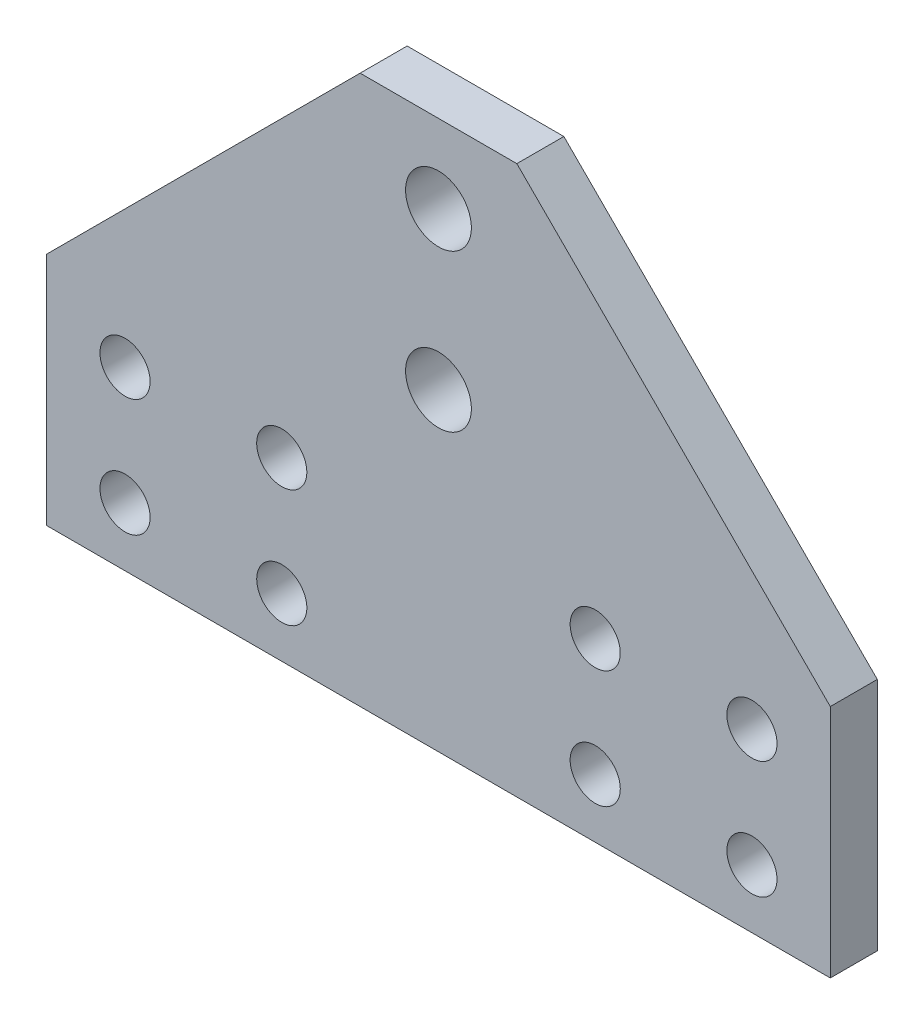
ISO-10303-21;
HEADER;
FILE_DESCRIPTION(('STEP AP214'),'2;1');
FILE_NAME('part.step','',(''),(''),'','','');
FILE_SCHEMA(('AUTOMOTIVE_DESIGN { 1 0 10303 214 1 1 1 1 }'));
ENDSEC;
DATA;
#1=APPLICATION_CONTEXT('core data for automotive mechanical design processes');
#2=APPLICATION_PROTOCOL_DEFINITION('international standard','automotive_design',2000,#1);
#3=PRODUCT_CONTEXT('',#1,'mechanical');
#4=PRODUCT('Part','Part','',(#3));
#5=PRODUCT_RELATED_PRODUCT_CATEGORY('part','',(#4));
#6=PRODUCT_DEFINITION_FORMATION('','',#4);
#7=PRODUCT_DEFINITION_CONTEXT('part definition',#1,'design');
#8=PRODUCT_DEFINITION('design','',#6,#7);
#9=PRODUCT_DEFINITION_SHAPE('','',#8);
#10=(LENGTH_UNIT() NAMED_UNIT(*) SI_UNIT(.MILLI.,.METRE.));
#11=(NAMED_UNIT(*) PLANE_ANGLE_UNIT() SI_UNIT($,.RADIAN.));
#12=(NAMED_UNIT(*) SI_UNIT($,.STERADIAN.) SOLID_ANGLE_UNIT());
#13=UNCERTAINTY_MEASURE_WITH_UNIT(LENGTH_MEASURE(1.E-05),#10,'distance_accuracy_value','');
#14=(GEOMETRIC_REPRESENTATION_CONTEXT(3) GLOBAL_UNCERTAINTY_ASSIGNED_CONTEXT((#13)) GLOBAL_UNIT_ASSIGNED_CONTEXT((#10,
#11,#12)) REPRESENTATION_CONTEXT('',''));
#15=CARTESIAN_POINT('',(0.,0.,0.));
#16=DIRECTION('',(0.,0.,1.));
#17=DIRECTION('',(1.,0.,0.));
#18=AXIS2_PLACEMENT_3D('',#15,#16,#17);
#19=CARTESIAN_POINT('',(-20.,-20.,3.));
#20=DIRECTION('',(0.707106781186548,-0.707106781186547,0.));
#21=DIRECTION('',(0.707106781186547,0.707106781186548,0.));
#22=AXIS2_PLACEMENT_3D('',#19,#20,#21);
#23=PLANE('',#22);
#24=DIRECTION('',(-0.707106781186547,-0.707106781186548,0.));
#25=VECTOR('',#24,1.);
#26=CARTESIAN_POINT('',(-20.,-20.,0.));
#27=LINE('',#26,#25);
#28=CARTESIAN_POINT('',(0.,0.,0.));
#29=VERTEX_POINT('',#28);
#30=CARTESIAN_POINT('',(-20.,-20.,0.));
#31=VERTEX_POINT('',#30);
#32=EDGE_CURVE('E132',#29,#31,#27,.T.);
#33=ORIENTED_EDGE('',*,*,#32,.T.);
#34=DIRECTION('',(0.,0.,-1.));
#35=VECTOR('',#34,1.);
#36=CARTESIAN_POINT('',(-20.,-20.,3.));
#37=LINE('',#36,#35);
#38=CARTESIAN_POINT('',(-20.,-20.,3.));
#39=VERTEX_POINT('',#38);
#40=EDGE_CURVE('E11',#39,#31,#37,.T.);
#41=ORIENTED_EDGE('',*,*,#40,.F.);
#42=DIRECTION('',(-0.707106781186547,-0.707106781186548,0.));
#43=VECTOR('',#42,1.);
#44=CARTESIAN_POINT('',(-20.,-20.,3.));
#45=LINE('',#44,#43);
#46=CARTESIAN_POINT('',(0.,0.,3.));
#47=VERTEX_POINT('',#46);
#48=EDGE_CURVE('E149',#47,#39,#45,.T.);
#49=ORIENTED_EDGE('',*,*,#48,.F.);
#50=DIRECTION('',(0.,0.,-1.));
#51=VECTOR('',#50,1.);
#52=CARTESIAN_POINT('',(0.,0.,3.));
#53=LINE('',#52,#51);
#54=EDGE_CURVE('E128',#47,#29,#53,.T.);
#55=ORIENTED_EDGE('',*,*,#54,.T.);
#56=EDGE_LOOP('',(#33,#41,#49,#55));
#57=FACE_BOUND('',#56,.T.);
#58=ADVANCED_FACE('F43',(#57),#23,.F.);
#59=CARTESIAN_POINT('',(-20.,-35.,3.));
#60=DIRECTION('',(1.,0.,0.));
#61=DIRECTION('',(0.,1.,0.));
#62=AXIS2_PLACEMENT_3D('',#59,#60,#61);
#63=PLANE('',#62);
#64=DIRECTION('',(0.,-1.,0.));
#65=VECTOR('',#64,1.);
#66=CARTESIAN_POINT('',(-20.,-35.,0.));
#67=LINE('',#66,#65);
#68=CARTESIAN_POINT('',(-20.,-35.,0.));
#69=VERTEX_POINT('',#68);
#70=EDGE_CURVE('E136',#31,#69,#67,.T.);
#71=ORIENTED_EDGE('',*,*,#70,.T.);
#72=DIRECTION('',(0.,0.,-1.));
#73=VECTOR('',#72,1.);
#74=CARTESIAN_POINT('',(-20.,-35.,3.));
#75=LINE('',#74,#73);
#76=CARTESIAN_POINT('',(-20.,-35.,3.));
#77=VERTEX_POINT('',#76);
#78=EDGE_CURVE('E52',#77,#69,#75,.T.);
#79=ORIENTED_EDGE('',*,*,#78,.F.);
#80=DIRECTION('',(0.,-1.,0.));
#81=VECTOR('',#80,1.);
#82=CARTESIAN_POINT('',(-20.,-35.,3.));
#83=LINE('',#82,#81);
#84=EDGE_CURVE('E97',#39,#77,#83,.T.);
#85=ORIENTED_EDGE('',*,*,#84,.F.);
#86=ORIENTED_EDGE('',*,*,#40,.T.);
#87=EDGE_LOOP('',(#71,#79,#85,#86));
#88=FACE_BOUND('',#87,.T.);
#89=ADVANCED_FACE('F178',(#88),#63,.F.);
#90=CARTESIAN_POINT('',(30.,-35.,3.));
#91=DIRECTION('',(0.,1.,0.));
#92=DIRECTION('',(-1.,0.,0.));
#93=AXIS2_PLACEMENT_3D('',#90,#91,#92);
#94=PLANE('',#93);
#95=DIRECTION('',(1.,0.,0.));
#96=VECTOR('',#95,1.);
#97=CARTESIAN_POINT('',(30.,-35.,0.));
#98=LINE('',#97,#96);
#99=CARTESIAN_POINT('',(30.,-35.,0.));
#100=VERTEX_POINT('',#99);
#101=EDGE_CURVE('E140',#69,#100,#98,.T.);
#102=ORIENTED_EDGE('',*,*,#101,.T.);
#103=DIRECTION('',(0.,0.,-1.));
#104=VECTOR('',#103,1.);
#105=CARTESIAN_POINT('',(30.,-35.,3.));
#106=LINE('',#105,#104);
#107=CARTESIAN_POINT('',(30.,-35.,3.));
#108=VERTEX_POINT('',#107);
#109=EDGE_CURVE('E121',#108,#100,#106,.T.);
#110=ORIENTED_EDGE('',*,*,#109,.F.);
#111=DIRECTION('',(1.,0.,0.));
#112=VECTOR('',#111,1.);
#113=CARTESIAN_POINT('',(30.,-35.,3.));
#114=LINE('',#113,#112);
#115=EDGE_CURVE('E110',#77,#108,#114,.T.);
#116=ORIENTED_EDGE('',*,*,#115,.F.);
#117=ORIENTED_EDGE('',*,*,#78,.T.);
#118=EDGE_LOOP('',(#102,#110,#116,#117));
#119=FACE_BOUND('',#118,.T.);
#120=ADVANCED_FACE('F159',(#119),#94,.F.);
#121=CARTESIAN_POINT('',(30.,-20.,3.));
#122=DIRECTION('',(-1.,0.,0.));
#123=DIRECTION('',(0.,-1.,0.));
#124=AXIS2_PLACEMENT_3D('',#121,#122,#123);
#125=PLANE('',#124);
#126=DIRECTION('',(0.,1.,0.));
#127=VECTOR('',#126,1.);
#128=CARTESIAN_POINT('',(30.,-20.,0.));
#129=LINE('',#128,#127);
#130=CARTESIAN_POINT('',(30.,-20.,0.));
#131=VERTEX_POINT('',#130);
#132=EDGE_CURVE('E119',#100,#131,#129,.T.);
#133=ORIENTED_EDGE('',*,*,#132,.T.);
#134=DIRECTION('',(0.,0.,-1.));
#135=VECTOR('',#134,1.);
#136=CARTESIAN_POINT('',(30.,-20.,3.));
#137=LINE('',#136,#135);
#138=CARTESIAN_POINT('',(30.,-20.,3.));
#139=VERTEX_POINT('',#138);
#140=EDGE_CURVE('E116',#139,#131,#137,.T.);
#141=ORIENTED_EDGE('',*,*,#140,.F.);
#142=DIRECTION('',(0.,1.,0.));
#143=VECTOR('',#142,1.);
#144=CARTESIAN_POINT('',(30.,-20.,3.));
#145=LINE('',#144,#143);
#146=EDGE_CURVE('E104',#108,#139,#145,.T.);
#147=ORIENTED_EDGE('',*,*,#146,.F.);
#148=ORIENTED_EDGE('',*,*,#109,.T.);
#149=EDGE_LOOP('',(#133,#141,#147,#148));
#150=FACE_BOUND('',#149,.T.);
#151=ADVANCED_FACE('F117',(#150),#125,.F.);
#152=CARTESIAN_POINT('',(10.,0.,3.));
#153=DIRECTION('',(-0.707106781186547,-0.707106781186548,0.));
#154=DIRECTION('',(0.707106781186548,-0.707106781186547,0.));
#155=AXIS2_PLACEMENT_3D('',#152,#153,#154);
#156=PLANE('',#155);
#157=DIRECTION('',(-0.707106781186548,0.707106781186547,0.));
#158=VECTOR('',#157,1.);
#159=CARTESIAN_POINT('',(10.,0.,0.));
#160=LINE('',#159,#158);
#161=CARTESIAN_POINT('',(10.,0.,0.));
#162=VERTEX_POINT('',#161);
#163=EDGE_CURVE('E83',#131,#162,#160,.T.);
#164=ORIENTED_EDGE('',*,*,#163,.T.);
#165=DIRECTION('',(0.,0.,-1.));
#166=VECTOR('',#165,1.);
#167=CARTESIAN_POINT('',(10.,0.,3.));
#168=LINE('',#167,#166);
#169=CARTESIAN_POINT('',(10.,0.,3.));
#170=VERTEX_POINT('',#169);
#171=EDGE_CURVE('E122',#170,#162,#168,.T.);
#172=ORIENTED_EDGE('',*,*,#171,.F.);
#173=DIRECTION('',(-0.707106781186548,0.707106781186547,0.));
#174=VECTOR('',#173,1.);
#175=CARTESIAN_POINT('',(10.,0.,3.));
#176=LINE('',#175,#174);
#177=EDGE_CURVE('E108',#139,#170,#176,.T.);
#178=ORIENTED_EDGE('',*,*,#177,.F.);
#179=ORIENTED_EDGE('',*,*,#140,.T.);
#180=EDGE_LOOP('',(#164,#172,#178,#179));
#181=FACE_BOUND('',#180,.T.);
#182=ADVANCED_FACE('F124',(#181),#156,.F.);
#183=CARTESIAN_POINT('',(0.,0.,3.));
#184=DIRECTION('',(0.,-1.,0.));
#185=DIRECTION('',(0.,0.,-1.));
#186=AXIS2_PLACEMENT_3D('',#183,#184,#185);
#187=PLANE('',#186);
#188=DIRECTION('',(-1.,0.,0.));
#189=VECTOR('',#188,1.);
#190=CARTESIAN_POINT('',(0.,0.,0.));
#191=LINE('',#190,#189);
#192=EDGE_CURVE('E89',#162,#29,#191,.T.);
#193=ORIENTED_EDGE('',*,*,#192,.T.);
#194=ORIENTED_EDGE('',*,*,#54,.F.);
#195=DIRECTION('',(-1.,0.,0.));
#196=VECTOR('',#195,1.);
#197=CARTESIAN_POINT('',(0.,0.,3.));
#198=LINE('',#197,#196);
#199=EDGE_CURVE('E60',#170,#47,#198,.T.);
#200=ORIENTED_EDGE('',*,*,#199,.F.);
#201=ORIENTED_EDGE('',*,*,#171,.T.);
#202=EDGE_LOOP('',(#193,#194,#200,#201));
#203=FACE_BOUND('',#202,.T.);
#204=ADVANCED_FACE('F166',(#203),#187,.F.);
#205=CARTESIAN_POINT('',(0.,0.,3.));
#206=DIRECTION('',(0.,0.,-1.));
#207=DIRECTION('',(-1.,0.,0.));
#208=AXIS2_PLACEMENT_3D('',#205,#206,#207);
#209=PLANE('',#208);
#210=CARTESIAN_POINT('',(15.,-23.75,3.));
#211=DIRECTION('',(0.,0.,1.));
#212=DIRECTION('',(-1.,0.,0.));
#213=AXIS2_PLACEMENT_3D('',#210,#211,#212);
#214=CIRCLE('',#213,1.6);
#215=CARTESIAN_POINT('',(13.4,-23.75,3.));
#216=VERTEX_POINT('',#215);
#217=EDGE_CURVE('E374',#216,#216,#214,.T.);
#218=ORIENTED_EDGE('',*,*,#217,.F.);
#219=EDGE_LOOP('',(#218));
#220=FACE_BOUND('',#219,.T.);
#221=CARTESIAN_POINT('',(15.,-31.25,3.));
#222=DIRECTION('',(0.,0.,1.));
#223=DIRECTION('',(1.,0.,0.));
#224=AXIS2_PLACEMENT_3D('',#221,#222,#223);
#225=CIRCLE('',#224,1.6);
#226=CARTESIAN_POINT('',(16.6,-31.25,3.));
#227=VERTEX_POINT('',#226);
#228=EDGE_CURVE('E383',#227,#227,#225,.T.);
#229=ORIENTED_EDGE('',*,*,#228,.F.);
#230=EDGE_LOOP('',(#229));
#231=FACE_BOUND('',#230,.T.);
#232=CARTESIAN_POINT('',(25.,-31.25,3.));
#233=DIRECTION('',(0.,0.,1.));
#234=DIRECTION('',(-1.,0.,0.));
#235=AXIS2_PLACEMENT_3D('',#232,#233,#234);
#236=CIRCLE('',#235,1.6);
#237=CARTESIAN_POINT('',(23.4,-31.25,3.));
#238=VERTEX_POINT('',#237);
#239=EDGE_CURVE('E396',#238,#238,#236,.T.);
#240=ORIENTED_EDGE('',*,*,#239,.F.);
#241=EDGE_LOOP('',(#240));
#242=FACE_BOUND('',#241,.T.);
#243=CARTESIAN_POINT('',(5.,-5.,3.));
#244=DIRECTION('',(0.,0.,1.));
#245=DIRECTION('',(1.,0.,0.));
#246=AXIS2_PLACEMENT_3D('',#243,#244,#245);
#247=CIRCLE('',#246,2.1);
#248=CARTESIAN_POINT('',(7.1,-5.,3.));
#249=VERTEX_POINT('',#248);
#250=EDGE_CURVE('E461',#249,#249,#247,.T.);
#251=ORIENTED_EDGE('',*,*,#250,.F.);
#252=EDGE_LOOP('',(#251));
#253=FACE_BOUND('',#252,.T.);
#254=CARTESIAN_POINT('',(-4.99999999999998,-31.25,3.));
#255=DIRECTION('',(0.,0.,1.));
#256=DIRECTION('',(-1.,0.,0.));
#257=AXIS2_PLACEMENT_3D('',#254,#255,#256);
#258=CIRCLE('',#257,1.6);
#259=CARTESIAN_POINT('',(-6.59999999999998,-31.25,3.));
#260=VERTEX_POINT('',#259);
#261=EDGE_CURVE('E409',#260,#260,#258,.T.);
#262=ORIENTED_EDGE('',*,*,#261,.F.);
#263=EDGE_LOOP('',(#262));
#264=FACE_BOUND('',#263,.T.);
#265=CARTESIAN_POINT('',(-4.99999999999998,-23.75,3.));
#266=DIRECTION('',(0.,0.,1.));
#267=DIRECTION('',(1.,0.,0.));
#268=AXIS2_PLACEMENT_3D('',#265,#266,#267);
#269=CIRCLE('',#268,1.6);
#270=CARTESIAN_POINT('',(-3.39999999999998,-23.75,3.));
#271=VERTEX_POINT('',#270);
#272=EDGE_CURVE('E418',#271,#271,#269,.T.);
#273=ORIENTED_EDGE('',*,*,#272,.F.);
#274=EDGE_LOOP('',(#273));
#275=FACE_BOUND('',#274,.T.);
#276=CARTESIAN_POINT('',(-15.,-23.75,3.));
#277=DIRECTION('',(0.,0.,1.));
#278=DIRECTION('',(-1.,0.,0.));
#279=AXIS2_PLACEMENT_3D('',#276,#277,#278);
#280=CIRCLE('',#279,1.6);
#281=CARTESIAN_POINT('',(-16.6,-23.75,3.));
#282=VERTEX_POINT('',#281);
#283=EDGE_CURVE('E397',#282,#282,#280,.T.);
#284=ORIENTED_EDGE('',*,*,#283,.F.);
#285=EDGE_LOOP('',(#284));
#286=FACE_BOUND('',#285,.T.);
#287=CARTESIAN_POINT('',(25.,-23.75,3.));
#288=DIRECTION('',(0.,0.,1.));
#289=DIRECTION('',(1.,0.,0.));
#290=AXIS2_PLACEMENT_3D('',#287,#288,#289);
#291=CIRCLE('',#290,1.6);
#292=CARTESIAN_POINT('',(26.6,-23.75,3.));
#293=VERTEX_POINT('',#292);
#294=EDGE_CURVE('E381',#293,#293,#291,.T.);
#295=ORIENTED_EDGE('',*,*,#294,.F.);
#296=EDGE_LOOP('',(#295));
#297=FACE_BOUND('',#296,.T.);
#298=CARTESIAN_POINT('',(5.,-15.,3.));
#299=DIRECTION('',(0.,0.,1.));
#300=DIRECTION('',(1.,0.,0.));
#301=AXIS2_PLACEMENT_3D('',#298,#299,#300);
#302=CIRCLE('',#301,2.1);
#303=CARTESIAN_POINT('',(7.1,-15.,3.));
#304=VERTEX_POINT('',#303);
#305=EDGE_CURVE('E453',#304,#304,#302,.T.);
#306=ORIENTED_EDGE('',*,*,#305,.F.);
#307=EDGE_LOOP('',(#306));
#308=FACE_BOUND('',#307,.T.);
#309=CARTESIAN_POINT('',(-15.,-31.25,3.));
#310=DIRECTION('',(0.,0.,1.));
#311=DIRECTION('',(1.,0.,0.));
#312=AXIS2_PLACEMENT_3D('',#309,#310,#311);
#313=CIRCLE('',#312,1.6);
#314=CARTESIAN_POINT('',(-13.4,-31.25,3.));
#315=VERTEX_POINT('',#314);
#316=EDGE_CURVE('E413',#315,#315,#313,.T.);
#317=ORIENTED_EDGE('',*,*,#316,.F.);
#318=EDGE_LOOP('',(#317));
#319=FACE_BOUND('',#318,.T.);
#320=ORIENTED_EDGE('',*,*,#48,.T.);
#321=ORIENTED_EDGE('',*,*,#84,.T.);
#322=ORIENTED_EDGE('',*,*,#115,.T.);
#323=ORIENTED_EDGE('',*,*,#146,.T.);
#324=ORIENTED_EDGE('',*,*,#177,.T.);
#325=ORIENTED_EDGE('',*,*,#199,.T.);
#326=EDGE_LOOP('',(#320,#321,#322,#323,#324,#325));
#327=FACE_BOUND('',#326,.T.);
#328=ADVANCED_FACE('F106',(#220,#231,#242,#253,#264,#275,#286,#297,#308,#319,#327),#209,.F.);
#329=CARTESIAN_POINT('',(0.,0.,0.));
#330=DIRECTION('',(0.,0.,-1.));
#331=DIRECTION('',(-1.,0.,0.));
#332=AXIS2_PLACEMENT_3D('',#329,#330,#331);
#333=PLANE('',#332);
#334=CARTESIAN_POINT('',(15.,-23.75,0.));
#335=DIRECTION('',(0.,0.,1.));
#336=DIRECTION('',(-1.,0.,0.));
#337=AXIS2_PLACEMENT_3D('',#334,#335,#336);
#338=CIRCLE('',#337,1.6);
#339=CARTESIAN_POINT('',(13.4,-23.75,0.));
#340=VERTEX_POINT('',#339);
#341=EDGE_CURVE('E371',#340,#340,#338,.T.);
#342=ORIENTED_EDGE('',*,*,#341,.T.);
#343=EDGE_LOOP('',(#342));
#344=FACE_BOUND('',#343,.T.);
#345=CARTESIAN_POINT('',(15.,-31.25,0.));
#346=DIRECTION('',(0.,0.,1.));
#347=DIRECTION('',(1.,0.,0.));
#348=AXIS2_PLACEMENT_3D('',#345,#346,#347);
#349=CIRCLE('',#348,1.6);
#350=CARTESIAN_POINT('',(16.6,-31.25,0.));
#351=VERTEX_POINT('',#350);
#352=EDGE_CURVE('E392',#351,#351,#349,.T.);
#353=ORIENTED_EDGE('',*,*,#352,.T.);
#354=EDGE_LOOP('',(#353));
#355=FACE_BOUND('',#354,.T.);
#356=CARTESIAN_POINT('',(25.,-31.25,0.));
#357=DIRECTION('',(0.,0.,1.));
#358=DIRECTION('',(-1.,0.,0.));
#359=AXIS2_PLACEMENT_3D('',#356,#357,#358);
#360=CIRCLE('',#359,1.6);
#361=CARTESIAN_POINT('',(23.4,-31.25,0.));
#362=VERTEX_POINT('',#361);
#363=EDGE_CURVE('E468',#362,#362,#360,.T.);
#364=ORIENTED_EDGE('',*,*,#363,.T.);
#365=EDGE_LOOP('',(#364));
#366=FACE_BOUND('',#365,.T.);
#367=CARTESIAN_POINT('',(5.,-5.,0.));
#368=DIRECTION('',(0.,0.,1.));
#369=DIRECTION('',(1.,0.,0.));
#370=AXIS2_PLACEMENT_3D('',#367,#368,#369);
#371=CIRCLE('',#370,2.1);
#372=CARTESIAN_POINT('',(7.1,-5.,0.));
#373=VERTEX_POINT('',#372);
#374=EDGE_CURVE('E386',#373,#373,#371,.T.);
#375=ORIENTED_EDGE('',*,*,#374,.T.);
#376=EDGE_LOOP('',(#375));
#377=FACE_BOUND('',#376,.T.);
#378=CARTESIAN_POINT('',(-4.99999999999998,-31.25,0.));
#379=DIRECTION('',(0.,0.,1.));
#380=DIRECTION('',(-1.,0.,0.));
#381=AXIS2_PLACEMENT_3D('',#378,#379,#380);
#382=CIRCLE('',#381,1.6);
#383=CARTESIAN_POINT('',(-6.59999999999998,-31.25,0.));
#384=VERTEX_POINT('',#383);
#385=EDGE_CURVE('E414',#384,#384,#382,.T.);
#386=ORIENTED_EDGE('',*,*,#385,.T.);
#387=EDGE_LOOP('',(#386));
#388=FACE_BOUND('',#387,.T.);
#389=CARTESIAN_POINT('',(-4.99999999999998,-23.75,0.));
#390=DIRECTION('',(0.,0.,1.));
#391=DIRECTION('',(1.,0.,0.));
#392=AXIS2_PLACEMENT_3D('',#389,#390,#391);
#393=CIRCLE('',#392,1.6);
#394=CARTESIAN_POINT('',(-3.39999999999998,-23.75,0.));
#395=VERTEX_POINT('',#394);
#396=EDGE_CURVE('E401',#395,#395,#393,.T.);
#397=ORIENTED_EDGE('',*,*,#396,.T.);
#398=EDGE_LOOP('',(#397));
#399=FACE_BOUND('',#398,.T.);
#400=CARTESIAN_POINT('',(-15.,-23.75,0.));
#401=DIRECTION('',(0.,0.,1.));
#402=DIRECTION('',(-1.,0.,0.));
#403=AXIS2_PLACEMENT_3D('',#400,#401,#402);
#404=CIRCLE('',#403,1.6);
#405=CARTESIAN_POINT('',(-16.6,-23.75,0.));
#406=VERTEX_POINT('',#405);
#407=EDGE_CURVE('E402',#406,#406,#404,.T.);
#408=ORIENTED_EDGE('',*,*,#407,.T.);
#409=EDGE_LOOP('',(#408));
#410=FACE_BOUND('',#409,.T.);
#411=CARTESIAN_POINT('',(25.,-23.75,0.));
#412=DIRECTION('',(0.,0.,1.));
#413=DIRECTION('',(1.,0.,0.));
#414=AXIS2_PLACEMENT_3D('',#411,#412,#413);
#415=CIRCLE('',#414,1.6);
#416=CARTESIAN_POINT('',(26.6,-23.75,0.));
#417=VERTEX_POINT('',#416);
#418=EDGE_CURVE('E376',#417,#417,#415,.T.);
#419=ORIENTED_EDGE('',*,*,#418,.T.);
#420=EDGE_LOOP('',(#419));
#421=FACE_BOUND('',#420,.T.);
#422=CARTESIAN_POINT('',(5.,-15.,0.));
#423=DIRECTION('',(0.,0.,1.));
#424=DIRECTION('',(1.,0.,0.));
#425=AXIS2_PLACEMENT_3D('',#422,#423,#424);
#426=CIRCLE('',#425,2.1);
#427=CARTESIAN_POINT('',(7.1,-15.,0.));
#428=VERTEX_POINT('',#427);
#429=EDGE_CURVE('E456',#428,#428,#426,.T.);
#430=ORIENTED_EDGE('',*,*,#429,.T.);
#431=EDGE_LOOP('',(#430));
#432=FACE_BOUND('',#431,.T.);
#433=CARTESIAN_POINT('',(-15.,-31.25,0.));
#434=DIRECTION('',(0.,0.,1.));
#435=DIRECTION('',(1.,0.,0.));
#436=AXIS2_PLACEMENT_3D('',#433,#434,#435);
#437=CIRCLE('',#436,1.6);
#438=CARTESIAN_POINT('',(-13.4,-31.25,0.));
#439=VERTEX_POINT('',#438);
#440=EDGE_CURVE('E137',#439,#439,#437,.T.);
#441=ORIENTED_EDGE('',*,*,#440,.T.);
#442=EDGE_LOOP('',(#441));
#443=FACE_BOUND('',#442,.T.);
#444=ORIENTED_EDGE('',*,*,#32,.F.);
#445=ORIENTED_EDGE('',*,*,#192,.F.);
#446=ORIENTED_EDGE('',*,*,#163,.F.);
#447=ORIENTED_EDGE('',*,*,#132,.F.);
#448=ORIENTED_EDGE('',*,*,#101,.F.);
#449=ORIENTED_EDGE('',*,*,#70,.F.);
#450=EDGE_LOOP('',(#444,#445,#446,#447,#448,#449));
#451=FACE_BOUND('',#450,.T.);
#452=ADVANCED_FACE('F162',(#344,#355,#366,#377,#388,#399,#410,#421,#432,#443,#451),#333,.T.);
#453=CARTESIAN_POINT('',(-15.,-31.25,0.));
#454=DIRECTION('',(0.,0.,1.));
#455=DIRECTION('',(1.,0.,0.));
#456=AXIS2_PLACEMENT_3D('',#453,#454,#455);
#457=CYLINDRICAL_SURFACE('',#456,1.6);
#458=ORIENTED_EDGE('',*,*,#440,.F.);
#459=EDGE_LOOP('',(#458));
#460=FACE_BOUND('',#459,.T.);
#461=ORIENTED_EDGE('',*,*,#316,.T.);
#462=EDGE_LOOP('',(#461));
#463=FACE_BOUND('',#462,.T.);
#464=ADVANCED_FACE('F218',(#460,#463),#457,.F.);
#465=CARTESIAN_POINT('',(5.,-15.,0.));
#466=DIRECTION('',(0.,0.,1.));
#467=DIRECTION('',(1.,0.,0.));
#468=AXIS2_PLACEMENT_3D('',#465,#466,#467);
#469=CYLINDRICAL_SURFACE('',#468,2.1);
#470=ORIENTED_EDGE('',*,*,#429,.F.);
#471=EDGE_LOOP('',(#470));
#472=FACE_BOUND('',#471,.T.);
#473=ORIENTED_EDGE('',*,*,#305,.T.);
#474=EDGE_LOOP('',(#473));
#475=FACE_BOUND('',#474,.T.);
#476=ADVANCED_FACE('F228',(#472,#475),#469,.F.);
#477=CARTESIAN_POINT('',(25.,-23.75,0.));
#478=DIRECTION('',(0.,0.,1.));
#479=DIRECTION('',(1.,0.,0.));
#480=AXIS2_PLACEMENT_3D('',#477,#478,#479);
#481=CYLINDRICAL_SURFACE('',#480,1.6);
#482=ORIENTED_EDGE('',*,*,#418,.F.);
#483=EDGE_LOOP('',(#482));
#484=FACE_BOUND('',#483,.T.);
#485=ORIENTED_EDGE('',*,*,#294,.T.);
#486=EDGE_LOOP('',(#485));
#487=FACE_BOUND('',#486,.T.);
#488=ADVANCED_FACE('F239',(#484,#487),#481,.F.);
#489=CARTESIAN_POINT('',(-15.,-23.75,0.));
#490=DIRECTION('',(0.,0.,1.));
#491=DIRECTION('',(1.,0.,0.));
#492=AXIS2_PLACEMENT_3D('',#489,#490,#491);
#493=CYLINDRICAL_SURFACE('',#492,1.6);
#494=ORIENTED_EDGE('',*,*,#407,.F.);
#495=EDGE_LOOP('',(#494));
#496=FACE_BOUND('',#495,.T.);
#497=ORIENTED_EDGE('',*,*,#283,.T.);
#498=EDGE_LOOP('',(#497));
#499=FACE_BOUND('',#498,.T.);
#500=ADVANCED_FACE('F250',(#496,#499),#493,.F.);
#501=CARTESIAN_POINT('',(-4.99999999999998,-23.75,0.));
#502=DIRECTION('',(0.,0.,1.));
#503=DIRECTION('',(1.,0.,0.));
#504=AXIS2_PLACEMENT_3D('',#501,#502,#503);
#505=CYLINDRICAL_SURFACE('',#504,1.6);
#506=ORIENTED_EDGE('',*,*,#396,.F.);
#507=EDGE_LOOP('',(#506));
#508=FACE_BOUND('',#507,.T.);
#509=ORIENTED_EDGE('',*,*,#272,.T.);
#510=EDGE_LOOP('',(#509));
#511=FACE_BOUND('',#510,.T.);
#512=ADVANCED_FACE('F261',(#508,#511),#505,.F.);
#513=CARTESIAN_POINT('',(-4.99999999999998,-31.25,0.));
#514=DIRECTION('',(0.,0.,1.));
#515=DIRECTION('',(1.,0.,0.));
#516=AXIS2_PLACEMENT_3D('',#513,#514,#515);
#517=CYLINDRICAL_SURFACE('',#516,1.6);
#518=ORIENTED_EDGE('',*,*,#385,.F.);
#519=EDGE_LOOP('',(#518));
#520=FACE_BOUND('',#519,.T.);
#521=ORIENTED_EDGE('',*,*,#261,.T.);
#522=EDGE_LOOP('',(#521));
#523=FACE_BOUND('',#522,.T.);
#524=ADVANCED_FACE('F272',(#520,#523),#517,.F.);
#525=CARTESIAN_POINT('',(5.,-5.,0.));
#526=DIRECTION('',(0.,0.,1.));
#527=DIRECTION('',(1.,0.,0.));
#528=AXIS2_PLACEMENT_3D('',#525,#526,#527);
#529=CYLINDRICAL_SURFACE('',#528,2.1);
#530=ORIENTED_EDGE('',*,*,#374,.F.);
#531=EDGE_LOOP('',(#530));
#532=FACE_BOUND('',#531,.T.);
#533=ORIENTED_EDGE('',*,*,#250,.T.);
#534=EDGE_LOOP('',(#533));
#535=FACE_BOUND('',#534,.T.);
#536=ADVANCED_FACE('F283',(#532,#535),#529,.F.);
#537=CARTESIAN_POINT('',(25.,-31.25,0.));
#538=DIRECTION('',(0.,0.,1.));
#539=DIRECTION('',(1.,0.,0.));
#540=AXIS2_PLACEMENT_3D('',#537,#538,#539);
#541=CYLINDRICAL_SURFACE('',#540,1.6);
#542=ORIENTED_EDGE('',*,*,#363,.F.);
#543=EDGE_LOOP('',(#542));
#544=FACE_BOUND('',#543,.T.);
#545=ORIENTED_EDGE('',*,*,#239,.T.);
#546=EDGE_LOOP('',(#545));
#547=FACE_BOUND('',#546,.T.);
#548=ADVANCED_FACE('F294',(#544,#547),#541,.F.);
#549=CARTESIAN_POINT('',(15.,-31.25,0.));
#550=DIRECTION('',(0.,0.,1.));
#551=DIRECTION('',(1.,0.,0.));
#552=AXIS2_PLACEMENT_3D('',#549,#550,#551);
#553=CYLINDRICAL_SURFACE('',#552,1.6);
#554=ORIENTED_EDGE('',*,*,#352,.F.);
#555=EDGE_LOOP('',(#554));
#556=FACE_BOUND('',#555,.T.);
#557=ORIENTED_EDGE('',*,*,#228,.T.);
#558=EDGE_LOOP('',(#557));
#559=FACE_BOUND('',#558,.T.);
#560=ADVANCED_FACE('F305',(#556,#559),#553,.F.);
#561=CARTESIAN_POINT('',(15.,-23.75,0.));
#562=DIRECTION('',(0.,0.,1.));
#563=DIRECTION('',(1.,0.,0.));
#564=AXIS2_PLACEMENT_3D('',#561,#562,#563);
#565=CYLINDRICAL_SURFACE('',#564,1.6);
#566=ORIENTED_EDGE('',*,*,#341,.F.);
#567=EDGE_LOOP('',(#566));
#568=FACE_BOUND('',#567,.T.);
#569=ORIENTED_EDGE('',*,*,#217,.T.);
#570=EDGE_LOOP('',(#569));
#571=FACE_BOUND('',#570,.T.);
#572=ADVANCED_FACE('F316',(#568,#571),#565,.F.);
#573=CLOSED_SHELL('',(#58,#89,#120,#151,#182,#204,#328,#452,#464,#476,#488,#500,#512,#524,#536,
#548,#560,#572));
#574=MANIFOLD_SOLID_BREP('B2',#573);
#575=ADVANCED_BREP_SHAPE_REPRESENTATION('',(#18,#574),#14);
#576=SHAPE_DEFINITION_REPRESENTATION(#9,#575);
ENDSEC;
END-ISO-10303-21;
